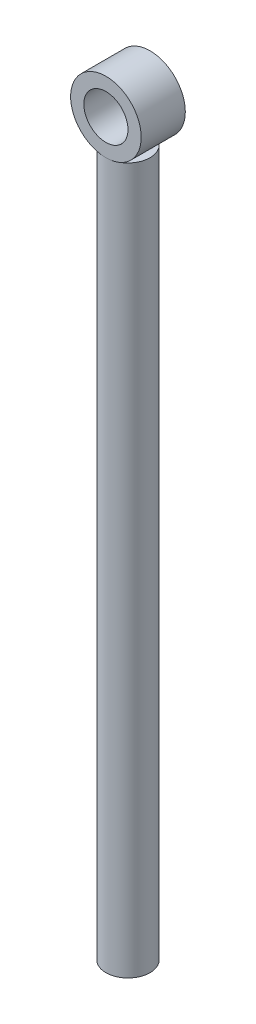
ISO-10303-21;
HEADER;
FILE_DESCRIPTION(('STEP AP214'),'2;1');
FILE_NAME('part.step','',(''),(''),'','','');
FILE_SCHEMA(('AUTOMOTIVE_DESIGN { 1 0 10303 214 1 1 1 1 }'));
ENDSEC;
DATA;
#1=APPLICATION_CONTEXT('core data for automotive mechanical design processes');
#2=APPLICATION_PROTOCOL_DEFINITION('international standard','automotive_design',2000,#1);
#3=PRODUCT_CONTEXT('',#1,'mechanical');
#4=PRODUCT('Part','Part','',(#3));
#5=PRODUCT_RELATED_PRODUCT_CATEGORY('part','',(#4));
#6=PRODUCT_DEFINITION_FORMATION('','',#4);
#7=PRODUCT_DEFINITION_CONTEXT('part definition',#1,'design');
#8=PRODUCT_DEFINITION('design','',#6,#7);
#9=PRODUCT_DEFINITION_SHAPE('','',#8);
#10=(LENGTH_UNIT() NAMED_UNIT(*) SI_UNIT(.MILLI.,.METRE.));
#11=(NAMED_UNIT(*) PLANE_ANGLE_UNIT() SI_UNIT($,.RADIAN.));
#12=(NAMED_UNIT(*) SI_UNIT($,.STERADIAN.) SOLID_ANGLE_UNIT());
#13=UNCERTAINTY_MEASURE_WITH_UNIT(LENGTH_MEASURE(1.E-05),#10,'distance_accuracy_value','');
#14=(GEOMETRIC_REPRESENTATION_CONTEXT(3) GLOBAL_UNCERTAINTY_ASSIGNED_CONTEXT((#13)) GLOBAL_UNIT_ASSIGNED_CONTEXT((#10,
#11,#12)) REPRESENTATION_CONTEXT('',''));
#15=CARTESIAN_POINT('',(0.,0.,0.));
#16=DIRECTION('',(0.,0.,1.));
#17=DIRECTION('',(1.,0.,0.));
#18=AXIS2_PLACEMENT_3D('',#15,#16,#17);
#19=CARTESIAN_POINT('',(0.,55.88,3.175));
#20=DIRECTION('',(0.,0.,1.));
#21=DIRECTION('',(1.,0.,0.));
#22=AXIS2_PLACEMENT_3D('',#19,#20,#21);
#23=PLANE('',#22);
#24=CARTESIAN_POINT('',(0.,55.88,3.175));
#25=DIRECTION('',(0.,0.,1.));
#26=DIRECTION('',(1.,0.,0.));
#27=AXIS2_PLACEMENT_3D('',#24,#25,#26);
#28=CIRCLE('',#27,5.08);
#29=CARTESIAN_POINT('',(5.08,55.88,3.175));
#30=VERTEX_POINT('',#29);
#31=EDGE_CURVE('E11',#30,#30,#28,.T.);
#32=ORIENTED_EDGE('',*,*,#31,.T.);
#33=EDGE_LOOP('',(#32));
#34=FACE_BOUND('',#33,.T.);
#35=CARTESIAN_POINT('',(0.,55.88,3.175));
#36=DIRECTION('',(0.,0.,1.));
#37=DIRECTION('',(1.,0.,0.));
#38=AXIS2_PLACEMENT_3D('',#35,#36,#37);
#39=CIRCLE('',#38,3.175);
#40=CARTESIAN_POINT('',(3.175,55.88,3.175));
#41=VERTEX_POINT('',#40);
#42=EDGE_CURVE('E56',#41,#41,#39,.T.);
#43=ORIENTED_EDGE('',*,*,#42,.F.);
#44=EDGE_LOOP('',(#43));
#45=FACE_BOUND('',#44,.T.);
#46=ADVANCED_FACE('F45',(#34,#45),#23,.T.);
#47=CARTESIAN_POINT('',(0.,55.88,-3.175));
#48=DIRECTION('',(0.,0.,1.));
#49=DIRECTION('',(1.,0.,0.));
#50=AXIS2_PLACEMENT_3D('',#47,#48,#49);
#51=PLANE('',#50);
#52=CARTESIAN_POINT('',(0.,55.88,-3.175));
#53=DIRECTION('',(0.,0.,1.));
#54=DIRECTION('',(1.,0.,0.));
#55=AXIS2_PLACEMENT_3D('',#52,#53,#54);
#56=CIRCLE('',#55,5.08);
#57=CARTESIAN_POINT('',(5.08,55.88,-3.175));
#58=VERTEX_POINT('',#57);
#59=EDGE_CURVE('E49',#58,#58,#56,.T.);
#60=ORIENTED_EDGE('',*,*,#59,.F.);
#61=EDGE_LOOP('',(#60));
#62=FACE_BOUND('',#61,.T.);
#63=CARTESIAN_POINT('',(0.,55.88,-3.175));
#64=DIRECTION('',(0.,0.,1.));
#65=DIRECTION('',(1.,0.,0.));
#66=AXIS2_PLACEMENT_3D('',#63,#64,#65);
#67=CIRCLE('',#66,3.175);
#68=CARTESIAN_POINT('',(3.175,55.88,-3.175));
#69=VERTEX_POINT('',#68);
#70=EDGE_CURVE('E58',#69,#69,#67,.T.);
#71=ORIENTED_EDGE('',*,*,#70,.T.);
#72=EDGE_LOOP('',(#71));
#73=FACE_BOUND('',#72,.T.);
#74=ADVANCED_FACE('F68',(#62,#73),#51,.F.);
#75=CARTESIAN_POINT('',(0.,55.88,3.175));
#76=DIRECTION('',(0.,0.,-1.));
#77=DIRECTION('',(-1.,0.,0.));
#78=AXIS2_PLACEMENT_3D('',#75,#76,#77);
#79=CYLINDRICAL_SURFACE('',#78,5.08);
#80=ORIENTED_EDGE('',*,*,#31,.F.);
#81=EDGE_LOOP('',(#80));
#82=FACE_BOUND('',#81,.T.);
#83=ORIENTED_EDGE('',*,*,#59,.T.);
#84=EDGE_LOOP('',(#83));
#85=FACE_BOUND('',#84,.T.);
#86=ADVANCED_FACE('F47',(#82,#85),#79,.T.);
#87=CARTESIAN_POINT('',(0.,55.88,3.175));
#88=DIRECTION('',(0.,0.,-1.));
#89=DIRECTION('',(-1.,0.,0.));
#90=AXIS2_PLACEMENT_3D('',#87,#88,#89);
#91=CYLINDRICAL_SURFACE('',#90,3.175);
#92=ORIENTED_EDGE('',*,*,#42,.T.);
#93=EDGE_LOOP('',(#92));
#94=FACE_BOUND('',#93,.T.);
#95=ORIENTED_EDGE('',*,*,#70,.F.);
#96=EDGE_LOOP('',(#95));
#97=FACE_BOUND('',#96,.T.);
#98=ADVANCED_FACE('F64',(#94,#97),#91,.F.);
#99=CLOSED_SHELL('',(#46,#74,#86,#98));
#100=MANIFOLD_SOLID_BREP('B2',#99);
#101=CARTESIAN_POINT('',(0.,50.8,0.));
#102=DIRECTION('',(0.,-1.,0.));
#103=DIRECTION('',(0.,0.,-1.));
#104=AXIS2_PLACEMENT_3D('',#101,#102,#103);
#105=CYLINDRICAL_SURFACE('',#104,3.175);
#106=CARTESIAN_POINT('',(0.,50.8,0.));
#107=DIRECTION('',(0.,1.,0.));
#108=DIRECTION('',(0.,0.,1.));
#109=AXIS2_PLACEMENT_3D('',#106,#107,#108);
#110=CIRCLE('',#109,3.175);
#111=CARTESIAN_POINT('',(0.,50.8,3.175));
#112=VERTEX_POINT('',#111);
#113=EDGE_CURVE('E44',#112,#112,#110,.T.);
#114=ORIENTED_EDGE('',*,*,#113,.F.);
#115=EDGE_LOOP('',(#114));
#116=FACE_BOUND('',#115,.T.);
#117=CARTESIAN_POINT('',(0.,-50.8,0.));
#118=DIRECTION('',(0.,1.,0.));
#119=DIRECTION('',(0.,0.,1.));
#120=AXIS2_PLACEMENT_3D('',#117,#118,#119);
#121=CIRCLE('',#120,3.175);
#122=CARTESIAN_POINT('',(0.,-50.8,3.175));
#123=VERTEX_POINT('',#122);
#124=EDGE_CURVE('E110',#123,#123,#121,.T.);
#125=ORIENTED_EDGE('',*,*,#124,.T.);
#126=EDGE_LOOP('',(#125));
#127=FACE_BOUND('',#126,.T.);
#128=ADVANCED_FACE('F107',(#116,#127),#105,.T.);
#129=CARTESIAN_POINT('',(0.,50.8,0.));
#130=DIRECTION('',(0.,1.,0.));
#131=DIRECTION('',(0.,0.,1.));
#132=AXIS2_PLACEMENT_3D('',#129,#130,#131);
#133=PLANE('',#132);
#134=ORIENTED_EDGE('',*,*,#113,.T.);
#135=EDGE_LOOP('',(#134));
#136=FACE_BOUND('',#135,.T.);
#137=ADVANCED_FACE('F122',(#136),#133,.T.);
#138=CARTESIAN_POINT('',(0.,-50.8,0.));
#139=DIRECTION('',(0.,1.,0.));
#140=DIRECTION('',(0.,0.,1.));
#141=AXIS2_PLACEMENT_3D('',#138,#139,#140);
#142=PLANE('',#141);
#143=ORIENTED_EDGE('',*,*,#124,.F.);
#144=EDGE_LOOP('',(#143));
#145=FACE_BOUND('',#144,.T.);
#146=ADVANCED_FACE('F120',(#145),#142,.F.);
#147=CLOSED_SHELL('',(#128,#137,#146));
#148=MANIFOLD_SOLID_BREP('B6',#147);
#149=ADVANCED_BREP_SHAPE_REPRESENTATION('',(#18,#100,#148),#14);
#150=SHAPE_DEFINITION_REPRESENTATION(#9,#149);
ENDSEC;
END-ISO-10303-21;
